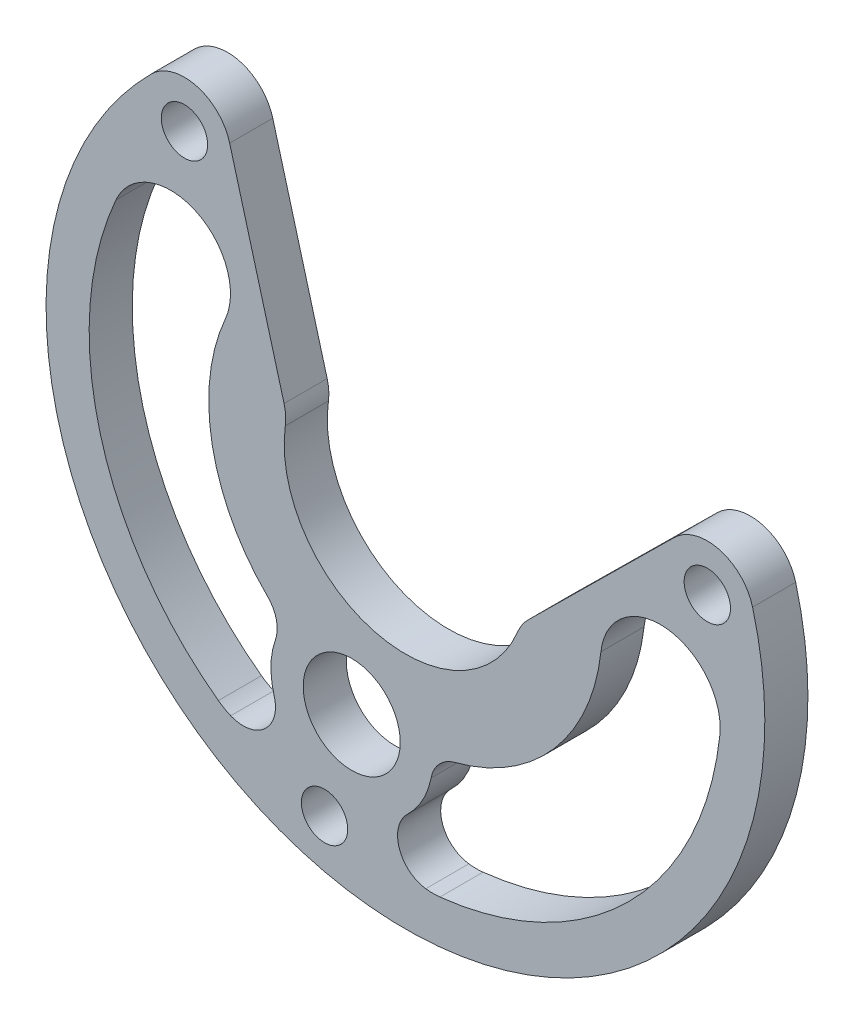
ISO-10303-21;
HEADER;
FILE_DESCRIPTION(('STEP AP214'),'2;1');
FILE_NAME('part.step','',(''),(''),'','','');
FILE_SCHEMA(('AUTOMOTIVE_DESIGN { 1 0 10303 214 1 1 1 1 }'));
ENDSEC;
DATA;
#1=APPLICATION_CONTEXT('core data for automotive mechanical design processes');
#2=APPLICATION_PROTOCOL_DEFINITION('international standard','automotive_design',2000,#1);
#3=PRODUCT_CONTEXT('',#1,'mechanical');
#4=PRODUCT('Part','Part','',(#3));
#5=PRODUCT_RELATED_PRODUCT_CATEGORY('part','',(#4));
#6=PRODUCT_DEFINITION_FORMATION('','',#4);
#7=PRODUCT_DEFINITION_CONTEXT('part definition',#1,'design');
#8=PRODUCT_DEFINITION('design','',#6,#7);
#9=PRODUCT_DEFINITION_SHAPE('','',#8);
#10=(LENGTH_UNIT() NAMED_UNIT(*) SI_UNIT(.MILLI.,.METRE.));
#11=(NAMED_UNIT(*) PLANE_ANGLE_UNIT() SI_UNIT($,.RADIAN.));
#12=(NAMED_UNIT(*) SI_UNIT($,.STERADIAN.) SOLID_ANGLE_UNIT());
#13=UNCERTAINTY_MEASURE_WITH_UNIT(LENGTH_MEASURE(1.E-05),#10,'distance_accuracy_value','');
#14=(GEOMETRIC_REPRESENTATION_CONTEXT(3) GLOBAL_UNCERTAINTY_ASSIGNED_CONTEXT((#13)) GLOBAL_UNIT_ASSIGNED_CONTEXT((#10,
#11,#12)) REPRESENTATION_CONTEXT('',''));
#15=CARTESIAN_POINT('',(0.,0.,0.));
#16=DIRECTION('',(0.,0.,1.));
#17=DIRECTION('',(1.,0.,0.));
#18=AXIS2_PLACEMENT_3D('',#15,#16,#17);
#19=CARTESIAN_POINT('',(130.039734994532,4.8095339761936,4.));
#20=DIRECTION('',(0.,0.,-1.));
#21=DIRECTION('',(-1.,0.,0.));
#22=AXIS2_PLACEMENT_3D('',#19,#20,#21);
#23=CYLINDRICAL_SURFACE('',#22,5.54999999999998);
#24=CARTESIAN_POINT('',(130.039734994532,4.8095339761936,4.));
#25=DIRECTION('',(0.,0.,1.));
#26=DIRECTION('',(1.,0.,0.));
#27=AXIS2_PLACEMENT_3D('',#24,#25,#26);
#28=CIRCLE('',#27,5.54999999999998);
#29=CARTESIAN_POINT('',(126.757039396607,0.334446310978311,4.));
#30=VERTEX_POINT('',#29);
#31=CARTESIAN_POINT('',(127.901748025322,-0.312136817550324,4.));
#32=VERTEX_POINT('',#31);
#33=EDGE_CURVE('E193',#30,#32,#28,.T.);
#34=ORIENTED_EDGE('',*,*,#33,.T.);
#35=DIRECTION('',(0.,0.,-1.));
#36=VECTOR('',#35,1.);
#37=CARTESIAN_POINT('',(127.901748025322,-0.312136817550324,4.));
#38=LINE('',#37,#36);
#39=CARTESIAN_POINT('',(127.901748025322,-0.312136817550324,0.));
#40=VERTEX_POINT('',#39);
#41=EDGE_CURVE('E332',#32,#40,#38,.T.);
#42=ORIENTED_EDGE('',*,*,#41,.T.);
#43=CARTESIAN_POINT('',(130.039734994532,4.8095339761936,0.));
#44=DIRECTION('',(0.,0.,1.));
#45=DIRECTION('',(1.,0.,0.));
#46=AXIS2_PLACEMENT_3D('',#43,#44,#45);
#47=CIRCLE('',#46,5.54999999999998);
#48=CARTESIAN_POINT('',(126.757039396607,0.334446310978304,0.));
#49=VERTEX_POINT('',#48);
#50=EDGE_CURVE('E212',#49,#40,#47,.T.);
#51=ORIENTED_EDGE('',*,*,#50,.F.);
#52=DIRECTION('',(0.,0.,-1.));
#53=VECTOR('',#52,1.);
#54=CARTESIAN_POINT('',(126.757039396607,0.334446310978311,4.));
#55=LINE('',#54,#53);
#56=EDGE_CURVE('E208',#30,#49,#55,.T.);
#57=ORIENTED_EDGE('',*,*,#56,.F.);
#58=EDGE_LOOP('',(#34,#42,#51,#57));
#59=FACE_BOUND('',#58,.T.);
#60=ADVANCED_FACE('F32',(#59),#23,.F.);
#61=CARTESIAN_POINT('',(172.128729043513,31.5057523079725,4.));
#62=DIRECTION('',(0.,0.,1.));
#63=DIRECTION('',(1.,0.,0.));
#64=AXIS2_PLACEMENT_3D('',#61,#62,#63);
#65=PLANE('',#64);
#66=CARTESIAN_POINT('',(139.134613462906,5.40592784393593,4.));
#67=DIRECTION('',(0.,0.,1.));
#68=DIRECTION('',(1.,0.,0.));
#69=AXIS2_PLACEMENT_3D('',#66,#67,#68);
#70=CIRCLE('',#69,4.49999999999999);
#71=CARTESIAN_POINT('',(143.634613462906,5.40592784393593,4.));
#72=VERTEX_POINT('',#71);
#73=EDGE_CURVE('E216',#72,#72,#70,.T.);
#74=ORIENTED_EDGE('',*,*,#73,.F.);
#75=EDGE_LOOP('',(#74));
#76=FACE_BOUND('',#75,.T.);
#77=CARTESIAN_POINT('',(144.11688008113,23.9999999999998,4.));
#78=DIRECTION('',(0.,0.,-1.));
#79=DIRECTION('',(1.,0.,0.));
#80=AXIS2_PLACEMENT_3D('',#77,#78,#79);
#81=CIRCLE('',#80,18.25);
#82=CARTESIAN_POINT('',(131.31932024548,10.9890445295918,4.));
#83=VERTEX_POINT('',#82);
#84=CARTESIAN_POINT('',(127.410923424776,31.3466667405033,4.));
#85=VERTEX_POINT('',#84);
#86=EDGE_CURVE('E181',#83,#85,#81,.T.);
#87=ORIENTED_EDGE('',*,*,#86,.F.);
#88=CARTESIAN_POINT('',(129.215611779345,8.85025732897677,4.));
#89=DIRECTION('',(0.,0.,1.));
#90=DIRECTION('',(1.,0.,0.));
#91=AXIS2_PLACEMENT_3D('',#88,#89,#90);
#92=CIRCLE('',#91,3.);
#93=CARTESIAN_POINT('',(132.049612260363,7.86616319039367,4.));
#94=VERTEX_POINT('',#93);
#95=EDGE_CURVE('E350',#83,#94,#92,.F.);
#96=ORIENTED_EDGE('',*,*,#95,.T.);
#97=CARTESIAN_POINT('',(139.134613462906,5.40592784393593,4.));
#98=DIRECTION('',(0.,0.,1.));
#99=DIRECTION('',(1.,0.,0.));
#100=AXIS2_PLACEMENT_3D('',#97,#98,#99);
#101=CIRCLE('',#100,7.50000000000001);
#102=CARTESIAN_POINT('',(131.936615744636,3.29907501381792,4.));
#103=VERTEX_POINT('',#102);
#104=EDGE_CURVE('E369',#94,#103,#101,.T.);
#105=ORIENTED_EDGE('',*,*,#104,.T.);
#106=CARTESIAN_POINT('',(129.057416657328,2.45633388177073,4.));
#107=DIRECTION('',(0.,0.,1.));
#108=DIRECTION('',(1.,0.,0.));
#109=AXIS2_PLACEMENT_3D('',#106,#107,#108);
#110=CIRCLE('',#109,3.);
#111=EDGE_CURVE('E344',#103,#32,#110,.F.);
#112=ORIENTED_EDGE('',*,*,#111,.T.);
#113=ORIENTED_EDGE('',*,*,#33,.F.);
#114=CARTESIAN_POINT('',(144.11688008113,23.9999999999998,4.));
#115=DIRECTION('',(0.,0.,1.));
#116=DIRECTION('',(1.,0.,0.));
#117=AXIS2_PLACEMENT_3D('',#114,#115,#116);
#118=CIRCLE('',#117,29.35);
#119=CARTESIAN_POINT('',(117.250040198172,35.815050347056,4.));
#120=VERTEX_POINT('',#119);
#121=EDGE_CURVE('E206',#120,#30,#118,.T.);
#122=ORIENTED_EDGE('',*,*,#121,.F.);
#123=CARTESIAN_POINT('',(122.330481811474,33.5808585437796,4.));
#124=DIRECTION('',(0.,0.,1.));
#125=DIRECTION('',(1.,0.,0.));
#126=AXIS2_PLACEMENT_3D('',#123,#124,#125);
#127=CIRCLE('',#126,5.54999999999999);
#128=EDGE_CURVE('E192',#85,#120,#127,.T.);
#129=ORIENTED_EDGE('',*,*,#128,.F.);
#130=EDGE_LOOP('',(#87,#96,#105,#112,#113,#122,#129));
#131=FACE_BOUND('',#130,.T.);
#132=CARTESIAN_POINT('',(146.712812326981,0.341996369622373,4.));
#133=DIRECTION('',(0.,0.,1.));
#134=DIRECTION('',(1.,0.,0.));
#135=AXIS2_PLACEMENT_3D('',#132,#133,#134);
#136=CIRCLE('',#135,5.54999999999999);
#137=CARTESIAN_POINT('',(146.003527958399,-5.1624941321848,4.));
#138=VERTEX_POINT('',#137);
#139=CARTESIAN_POINT('',(147.318166275068,-5.17489103157906,4.));
#140=VERTEX_POINT('',#139);
#141=EDGE_CURVE('E237',#138,#140,#136,.T.);
#142=ORIENTED_EDGE('',*,*,#141,.F.);
#143=CARTESIAN_POINT('',(146.386924914389,-2.18709386093767,4.));
#144=DIRECTION('',(0.,0.,1.));
#145=DIRECTION('',(1.,0.,0.));
#146=AXIS2_PLACEMENT_3D('',#143,#144,#145);
#147=CIRCLE('',#146,3.);
#148=CARTESIAN_POINT('',(144.314835928251,-0.0176590881166413,4.));
#149=VERTEX_POINT('',#148);
#150=EDGE_CURVE('E354',#138,#149,#147,.F.);
#151=ORIENTED_EDGE('',*,*,#150,.T.);
#152=CARTESIAN_POINT('',(146.50052216338,3.99405355198431,4.));
#153=VERTEX_POINT('',#152);
#154=EDGE_CURVE('E359',#149,#153,#101,.T.);
#155=ORIENTED_EDGE('',*,*,#154,.T.);
#156=CARTESIAN_POINT('',(149.44688564357,3.42930383520366,4.));
#157=DIRECTION('',(0.,0.,1.));
#158=DIRECTION('',(1.,0.,0.));
#159=AXIS2_PLACEMENT_3D('',#156,#157,#158);
#160=CIRCLE('',#159,3.);
#161=CARTESIAN_POINT('',(148.694414270049,6.33340211729253,4.));
#162=VERTEX_POINT('',#161);
#163=EDGE_CURVE('E40',#153,#162,#160,.F.);
#164=ORIENTED_EDGE('',*,*,#163,.T.);
#165=CARTESIAN_POINT('',(144.11688008113,23.9999999999998,4.));
#166=DIRECTION('',(0.,0.,-1.));
#167=DIRECTION('',(1.,0.,0.));
#168=AXIS2_PLACEMENT_3D('',#165,#166,#167);
#169=CIRCLE('',#168,18.25);
#170=CARTESIAN_POINT('',(162.257996310306,22.0094217022355,4.));
#171=VERTEX_POINT('',#170);
#172=EDGE_CURVE('E245',#171,#162,#169,.T.);
#173=ORIENTED_EDGE('',*,*,#172,.F.);
#174=CARTESIAN_POINT('',(167.774883711508,21.4040677541483,4.));
#175=DIRECTION('',(0.,0.,1.));
#176=DIRECTION('',(1.,0.,0.));
#177=AXIS2_PLACEMENT_3D('',#174,#175,#176);
#178=CIRCLE('',#177,5.54999999999999);
#179=CARTESIAN_POINT('',(173.291771112709,20.798713806061,4.));
#180=VERTEX_POINT('',#179);
#181=EDGE_CURVE('E242',#180,#171,#178,.T.);
#182=ORIENTED_EDGE('',*,*,#181,.F.);
#183=CARTESIAN_POINT('',(144.11688008113,23.9999999999998,4.));
#184=DIRECTION('',(0.,0.,1.));
#185=DIRECTION('',(1.,0.,0.));
#186=AXIS2_PLACEMENT_3D('',#183,#184,#185);
#187=CIRCLE('',#186,29.35);
#188=EDGE_CURVE('E239',#140,#180,#187,.T.);
#189=ORIENTED_EDGE('',*,*,#188,.F.);
#190=EDGE_LOOP('',(#142,#151,#155,#164,#173,#182,#189));
#191=FACE_BOUND('',#190,.T.);
#192=CARTESIAN_POINT('',(172.128729043513,31.5057523079725,4.));
#193=DIRECTION('',(0.,0.,1.));
#194=DIRECTION('',(1.,0.,0.));
#195=AXIS2_PLACEMENT_3D('',#192,#193,#194);
#196=CIRCLE('',#195,2.15000000000002);
#197=CARTESIAN_POINT('',(174.278729043513,31.5057523079725,4.));
#198=VERTEX_POINT('',#197);
#199=EDGE_CURVE('E231',#198,#198,#196,.T.);
#200=ORIENTED_EDGE('',*,*,#199,.F.);
#201=EDGE_LOOP('',(#200));
#202=FACE_BOUND('',#201,.T.);
#203=CARTESIAN_POINT('',(172.128729043513,31.5057523079725,4.));
#204=DIRECTION('',(0.,0.,1.));
#205=DIRECTION('',(1.,0.,0.));
#206=AXIS2_PLACEMENT_3D('',#203,#204,#205);
#207=CIRCLE('',#206,4.34999999999998);
#208=CARTESIAN_POINT('',(176.330506387871,32.6316151541685,4.));
#209=VERTEX_POINT('',#208);
#210=CARTESIAN_POINT('',(169.071208826311,34.5999517393923,4.));
#211=VERTEX_POINT('',#210);
#212=EDGE_CURVE('E269',#209,#211,#207,.T.);
#213=ORIENTED_EDGE('',*,*,#212,.T.);
#214=DIRECTION('',(-0.711310214119489,-0.702878210851131,0.));
#215=VECTOR('',#214,1.);
#216=CARTESIAN_POINT('',(169.071208826311,34.5999517393923,4.));
#217=LINE('',#216,#215);
#218=CARTESIAN_POINT('',(155.497898469746,21.1875419224473,4.));
#219=VERTEX_POINT('',#218);
#220=EDGE_CURVE('E272',#211,#219,#217,.T.);
#221=ORIENTED_EDGE('',*,*,#220,.T.);
#222=CARTESIAN_POINT('',(158.555418686949,18.0933424910275,4.));
#223=DIRECTION('',(0.,0.,1.));
#224=DIRECTION('',(1.,0.,0.));
#225=AXIS2_PLACEMENT_3D('',#222,#223,#224);
#226=CIRCLE('',#225,4.34999999999999);
#227=CARTESIAN_POINT('',(154.529287729557,19.740391219491,4.));
#228=VERTEX_POINT('',#227);
#229=EDGE_CURVE('E275',#219,#228,#226,.T.);
#230=ORIENTED_EDGE('',*,*,#229,.T.);
#231=CARTESIAN_POINT('',(144.11688008113,23.9999999999998,4.));
#232=DIRECTION('',(0.,0.,-1.));
#233=DIRECTION('',(1.,0.,0.));
#234=AXIS2_PLACEMENT_3D('',#231,#232,#233);
#235=CIRCLE('',#234,11.25);
#236=CARTESIAN_POINT('',(132.969666152779,25.5172744101105,4.));
#237=VERTEX_POINT('',#236);
#238=EDGE_CURVE('E277',#228,#237,#235,.T.);
#239=ORIENTED_EDGE('',*,*,#238,.T.);
#240=CARTESIAN_POINT('',(128.659410100484,26.1039538486866,4.));
#241=DIRECTION('',(0.,0.,1.));
#242=DIRECTION('',(1.,0.,0.));
#243=AXIS2_PLACEMENT_3D('',#240,#241,#242);
#244=CIRCLE('',#243,4.35000000000001);
#245=CARTESIAN_POINT('',(132.854399996875,27.2548490520706,4.));
#246=VERTEX_POINT('',#245);
#247=EDGE_CURVE('E279',#237,#246,#244,.T.);
#248=ORIENTED_EDGE('',*,*,#247,.T.);
#249=DIRECTION('',(-0.264573609973319,0.964365493423363,0.));
#250=VECTOR('',#249,1.);
#251=CARTESIAN_POINT('',(132.854399996875,27.2548490520706,4.));
#252=LINE('',#251,#250);
#253=CARTESIAN_POINT('',(127.805773323111,45.6569918577949,4.));
#254=VERTEX_POINT('',#253);
#255=EDGE_CURVE('E281',#246,#254,#252,.T.);
#256=ORIENTED_EDGE('',*,*,#255,.T.);
#257=CARTESIAN_POINT('',(123.61078342672,44.5060966544112,4.));
#258=DIRECTION('',(0.,0.,1.));
#259=DIRECTION('',(-1.,0.,0.));
#260=AXIS2_PLACEMENT_3D('',#257,#258,#259);
#261=CIRCLE('',#260,4.34999999999889);
#262=CARTESIAN_POINT('',(120.53486892856,47.582011152572,4.));
#263=VERTEX_POINT('',#262);
#264=EDGE_CURVE('E283',#254,#263,#261,.T.);
#265=ORIENTED_EDGE('',*,*,#264,.T.);
#266=CARTESIAN_POINT('',(144.11688008113,23.9999999999998,4.));
#267=DIRECTION('',(0.,0.,1.));
#268=DIRECTION('',(1.,0.,0.));
#269=AXIS2_PLACEMENT_3D('',#266,#267,#268);
#270=CIRCLE('',#269,33.35);
#271=EDGE_CURVE('E285',#263,#209,#270,.T.);
#272=ORIENTED_EDGE('',*,*,#271,.T.);
#273=EDGE_LOOP('',(#213,#221,#230,#239,#248,#256,#265,#272));
#274=FACE_BOUND('',#273,.T.);
#275=CARTESIAN_POINT('',(123.61078342672,44.5060966544112,4.));
#276=DIRECTION('',(0.,0.,1.));
#277=DIRECTION('',(1.,0.,0.));
#278=AXIS2_PLACEMENT_3D('',#275,#276,#277);
#279=CIRCLE('',#278,2.15);
#280=CARTESIAN_POINT('',(125.76078342672,44.5060966544112,4.));
#281=VERTEX_POINT('',#280);
#282=EDGE_CURVE('E263',#281,#281,#279,.T.);
#283=ORIENTED_EDGE('',*,*,#282,.F.);
#284=EDGE_LOOP('',(#283));
#285=FACE_BOUND('',#284,.T.);
#286=CARTESIAN_POINT('',(136.611127773157,-4.01184896238429,4.));
#287=DIRECTION('',(0.,0.,1.));
#288=DIRECTION('',(1.,0.,0.));
#289=AXIS2_PLACEMENT_3D('',#286,#287,#288);
#290=CIRCLE('',#289,2.15000000000002);
#291=CARTESIAN_POINT('',(138.761127773157,-4.01184896238429,4.));
#292=VERTEX_POINT('',#291);
#293=EDGE_CURVE('E225',#292,#292,#290,.T.);
#294=ORIENTED_EDGE('',*,*,#293,.F.);
#295=EDGE_LOOP('',(#294));
#296=FACE_BOUND('',#295,.T.);
#297=ADVANCED_FACE('F204',(#76,#131,#191,#202,#274,#285,#296),#65,.T.);
#298=CARTESIAN_POINT('',(172.128729043513,31.5057523079725,0.));
#299=DIRECTION('',(0.,0.,1.));
#300=DIRECTION('',(1.,0.,0.));
#301=AXIS2_PLACEMENT_3D('',#298,#299,#300);
#302=PLANE('',#301);
#303=CARTESIAN_POINT('',(139.134613462906,5.40592784393593,0.));
#304=DIRECTION('',(0.,0.,-1.));
#305=DIRECTION('',(-1.,0.,0.));
#306=AXIS2_PLACEMENT_3D('',#303,#304,#305);
#307=CIRCLE('',#306,4.49999999999999);
#308=CARTESIAN_POINT('',(134.634613462906,5.40592784393593,0.));
#309=VERTEX_POINT('',#308);
#310=EDGE_CURVE('E482',#309,#309,#307,.T.);
#311=ORIENTED_EDGE('',*,*,#310,.F.);
#312=EDGE_LOOP('',(#311));
#313=FACE_BOUND('',#312,.T.);
#314=CARTESIAN_POINT('',(139.134613462906,5.40592784393593,0.));
#315=DIRECTION('',(0.,0.,1.));
#316=DIRECTION('',(1.,0.,0.));
#317=AXIS2_PLACEMENT_3D('',#314,#315,#316);
#318=CIRCLE('',#317,7.50000000000001);
#319=CARTESIAN_POINT('',(132.049612260363,7.86616319039367,0.));
#320=VERTEX_POINT('',#319);
#321=CARTESIAN_POINT('',(131.936615744636,3.29907501381792,0.));
#322=VERTEX_POINT('',#321);
#323=EDGE_CURVE('E479',#320,#322,#318,.T.);
#324=ORIENTED_EDGE('',*,*,#323,.F.);
#325=CARTESIAN_POINT('',(129.215611779345,8.85025732897677,0.));
#326=DIRECTION('',(0.,0.,1.));
#327=DIRECTION('',(1.,0.,0.));
#328=AXIS2_PLACEMENT_3D('',#325,#326,#327);
#329=CIRCLE('',#328,3.);
#330=CARTESIAN_POINT('',(131.31932024548,10.9890445295918,0.));
#331=VERTEX_POINT('',#330);
#332=EDGE_CURVE('E348',#320,#331,#329,.T.);
#333=ORIENTED_EDGE('',*,*,#332,.T.);
#334=CARTESIAN_POINT('',(144.11688008113,23.9999999999998,0.));
#335=DIRECTION('',(0.,0.,-1.));
#336=DIRECTION('',(1.,0.,0.));
#337=AXIS2_PLACEMENT_3D('',#334,#335,#336);
#338=CIRCLE('',#337,18.25);
#339=CARTESIAN_POINT('',(127.410923424776,31.3466667405033,0.));
#340=VERTEX_POINT('',#339);
#341=EDGE_CURVE('E215',#331,#340,#338,.T.);
#342=ORIENTED_EDGE('',*,*,#341,.T.);
#343=CARTESIAN_POINT('',(122.330481811474,33.5808585437796,0.));
#344=DIRECTION('',(0.,0.,1.));
#345=DIRECTION('',(1.,0.,0.));
#346=AXIS2_PLACEMENT_3D('',#343,#344,#345);
#347=CIRCLE('',#346,5.54999999999999);
#348=CARTESIAN_POINT('',(117.250040198172,35.815050347056,0.));
#349=VERTEX_POINT('',#348);
#350=EDGE_CURVE('E200',#340,#349,#347,.T.);
#351=ORIENTED_EDGE('',*,*,#350,.T.);
#352=CARTESIAN_POINT('',(144.11688008113,23.9999999999998,0.));
#353=DIRECTION('',(0.,0.,1.));
#354=DIRECTION('',(1.,0.,0.));
#355=AXIS2_PLACEMENT_3D('',#352,#353,#354);
#356=CIRCLE('',#355,29.35);
#357=EDGE_CURVE('E219',#349,#49,#356,.T.);
#358=ORIENTED_EDGE('',*,*,#357,.T.);
#359=ORIENTED_EDGE('',*,*,#50,.T.);
#360=CARTESIAN_POINT('',(129.057416657328,2.45633388177073,0.));
#361=DIRECTION('',(0.,0.,1.));
#362=DIRECTION('',(1.,0.,0.));
#363=AXIS2_PLACEMENT_3D('',#360,#361,#362);
#364=CIRCLE('',#363,3.);
#365=EDGE_CURVE('E346',#40,#322,#364,.T.);
#366=ORIENTED_EDGE('',*,*,#365,.T.);
#367=EDGE_LOOP('',(#324,#333,#342,#351,#358,#359,#366));
#368=FACE_BOUND('',#367,.T.);
#369=CARTESIAN_POINT('',(136.611127773157,-4.01184896238429,0.));
#370=DIRECTION('',(0.,0.,1.));
#371=DIRECTION('',(1.,0.,0.));
#372=AXIS2_PLACEMENT_3D('',#369,#370,#371);
#373=CIRCLE('',#372,2.15000000000002);
#374=CARTESIAN_POINT('',(138.761127773157,-4.01184896238429,0.));
#375=VERTEX_POINT('',#374);
#376=EDGE_CURVE('E201',#375,#375,#373,.T.);
#377=ORIENTED_EDGE('',*,*,#376,.T.);
#378=EDGE_LOOP('',(#377));
#379=FACE_BOUND('',#378,.T.);
#380=CARTESIAN_POINT('',(172.128729043513,31.5057523079725,0.));
#381=DIRECTION('',(0.,0.,1.));
#382=DIRECTION('',(1.,0.,0.));
#383=AXIS2_PLACEMENT_3D('',#380,#381,#382);
#384=CIRCLE('',#383,2.15000000000002);
#385=CARTESIAN_POINT('',(174.278729043513,31.5057523079725,0.));
#386=VERTEX_POINT('',#385);
#387=EDGE_CURVE('E228',#386,#386,#384,.T.);
#388=ORIENTED_EDGE('',*,*,#387,.T.);
#389=EDGE_LOOP('',(#388));
#390=FACE_BOUND('',#389,.T.);
#391=CARTESIAN_POINT('',(144.11688008113,23.9999999999998,0.));
#392=DIRECTION('',(0.,0.,-1.));
#393=DIRECTION('',(1.,0.,0.));
#394=AXIS2_PLACEMENT_3D('',#391,#392,#393);
#395=CIRCLE('',#394,18.25);
#396=CARTESIAN_POINT('',(162.257996310306,22.0094217022355,0.));
#397=VERTEX_POINT('',#396);
#398=CARTESIAN_POINT('',(148.694414270049,6.33340211729253,0.));
#399=VERTEX_POINT('',#398);
#400=EDGE_CURVE('E240',#397,#399,#395,.T.);
#401=ORIENTED_EDGE('',*,*,#400,.T.);
#402=CARTESIAN_POINT('',(149.44688564357,3.42930383520366,0.));
#403=DIRECTION('',(0.,0.,1.));
#404=DIRECTION('',(1.,0.,0.));
#405=AXIS2_PLACEMENT_3D('',#402,#403,#404);
#406=CIRCLE('',#405,3.);
#407=CARTESIAN_POINT('',(146.50052216338,3.99405355198431,0.));
#408=VERTEX_POINT('',#407);
#409=EDGE_CURVE('E11',#399,#408,#406,.T.);
#410=ORIENTED_EDGE('',*,*,#409,.T.);
#411=CARTESIAN_POINT('',(144.314835928251,-0.0176590881166413,0.));
#412=VERTEX_POINT('',#411);
#413=EDGE_CURVE('E377',#412,#408,#318,.T.);
#414=ORIENTED_EDGE('',*,*,#413,.F.);
#415=CARTESIAN_POINT('',(146.386924914389,-2.18709386093767,0.));
#416=DIRECTION('',(0.,0.,1.));
#417=DIRECTION('',(1.,0.,0.));
#418=AXIS2_PLACEMENT_3D('',#415,#416,#417);
#419=CIRCLE('',#418,3.);
#420=CARTESIAN_POINT('',(146.003527958399,-5.1624941321848,0.));
#421=VERTEX_POINT('',#420);
#422=EDGE_CURVE('E352',#412,#421,#419,.T.);
#423=ORIENTED_EDGE('',*,*,#422,.T.);
#424=CARTESIAN_POINT('',(146.712812326981,0.341996369622373,0.));
#425=DIRECTION('',(0.,0.,1.));
#426=DIRECTION('',(1.,0.,0.));
#427=AXIS2_PLACEMENT_3D('',#424,#425,#426);
#428=CIRCLE('',#427,5.54999999999999);
#429=CARTESIAN_POINT('',(147.318166275068,-5.17489103157906,0.));
#430=VERTEX_POINT('',#429);
#431=EDGE_CURVE('E234',#421,#430,#428,.T.);
#432=ORIENTED_EDGE('',*,*,#431,.T.);
#433=CARTESIAN_POINT('',(144.11688008113,23.9999999999998,0.));
#434=DIRECTION('',(0.,0.,1.));
#435=DIRECTION('',(1.,0.,0.));
#436=AXIS2_PLACEMENT_3D('',#433,#434,#435);
#437=CIRCLE('',#436,29.35);
#438=CARTESIAN_POINT('',(173.291771112709,20.798713806061,0.));
#439=VERTEX_POINT('',#438);
#440=EDGE_CURVE('E249',#430,#439,#437,.T.);
#441=ORIENTED_EDGE('',*,*,#440,.T.);
#442=CARTESIAN_POINT('',(167.774883711508,21.4040677541483,0.));
#443=DIRECTION('',(0.,0.,1.));
#444=DIRECTION('',(1.,0.,0.));
#445=AXIS2_PLACEMENT_3D('',#442,#443,#444);
#446=CIRCLE('',#445,5.54999999999999);
#447=EDGE_CURVE('E252',#439,#397,#446,.T.);
#448=ORIENTED_EDGE('',*,*,#447,.T.);
#449=EDGE_LOOP('',(#401,#410,#414,#423,#432,#441,#448));
#450=FACE_BOUND('',#449,.T.);
#451=CARTESIAN_POINT('',(172.128729043513,31.5057523079725,0.));
#452=DIRECTION('',(0.,0.,1.));
#453=DIRECTION('',(1.,0.,0.));
#454=AXIS2_PLACEMENT_3D('',#451,#452,#453);
#455=CIRCLE('',#454,4.34999999999998);
#456=CARTESIAN_POINT('',(176.330506387871,32.6316151541685,0.));
#457=VERTEX_POINT('',#456);
#458=CARTESIAN_POINT('',(169.071208826311,34.5999517393923,0.));
#459=VERTEX_POINT('',#458);
#460=EDGE_CURVE('E266',#457,#459,#455,.T.);
#461=ORIENTED_EDGE('',*,*,#460,.F.);
#462=CARTESIAN_POINT('',(144.11688008113,23.9999999999998,0.));
#463=DIRECTION('',(0.,0.,1.));
#464=DIRECTION('',(1.,0.,0.));
#465=AXIS2_PLACEMENT_3D('',#462,#463,#464);
#466=CIRCLE('',#465,33.35);
#467=CARTESIAN_POINT('',(120.53486892856,47.582011152572,0.));
#468=VERTEX_POINT('',#467);
#469=EDGE_CURVE('E273',#468,#457,#466,.T.);
#470=ORIENTED_EDGE('',*,*,#469,.F.);
#471=CARTESIAN_POINT('',(123.61078342672,44.5060966544112,0.));
#472=DIRECTION('',(0.,0.,1.));
#473=DIRECTION('',(-1.,0.,0.));
#474=AXIS2_PLACEMENT_3D('',#471,#472,#473);
#475=CIRCLE('',#474,4.34999999999889);
#476=CARTESIAN_POINT('',(127.805773323111,45.6569918577949,0.));
#477=VERTEX_POINT('',#476);
#478=EDGE_CURVE('E300',#477,#468,#475,.T.);
#479=ORIENTED_EDGE('',*,*,#478,.F.);
#480=DIRECTION('',(-0.264573609973319,0.964365493423363,0.));
#481=VECTOR('',#480,1.);
#482=CARTESIAN_POINT('',(132.854399996875,27.2548490520706,0.));
#483=LINE('',#482,#481);
#484=CARTESIAN_POINT('',(132.854399996875,27.2548490520706,0.));
#485=VERTEX_POINT('',#484);
#486=EDGE_CURVE('E298',#485,#477,#483,.T.);
#487=ORIENTED_EDGE('',*,*,#486,.F.);
#488=CARTESIAN_POINT('',(128.659410100484,26.1039538486866,0.));
#489=DIRECTION('',(0.,0.,1.));
#490=DIRECTION('',(1.,0.,0.));
#491=AXIS2_PLACEMENT_3D('',#488,#489,#490);
#492=CIRCLE('',#491,4.35000000000001);
#493=CARTESIAN_POINT('',(132.969666152779,25.5172744101105,0.));
#494=VERTEX_POINT('',#493);
#495=EDGE_CURVE('E296',#494,#485,#492,.T.);
#496=ORIENTED_EDGE('',*,*,#495,.F.);
#497=CARTESIAN_POINT('',(144.11688008113,23.9999999999998,0.));
#498=DIRECTION('',(0.,0.,-1.));
#499=DIRECTION('',(1.,0.,0.));
#500=AXIS2_PLACEMENT_3D('',#497,#498,#499);
#501=CIRCLE('',#500,11.25);
#502=CARTESIAN_POINT('',(154.529287729557,19.740391219491,0.));
#503=VERTEX_POINT('',#502);
#504=EDGE_CURVE('E294',#503,#494,#501,.T.);
#505=ORIENTED_EDGE('',*,*,#504,.F.);
#506=CARTESIAN_POINT('',(158.555418686949,18.0933424910275,0.));
#507=DIRECTION('',(0.,0.,1.));
#508=DIRECTION('',(1.,0.,0.));
#509=AXIS2_PLACEMENT_3D('',#506,#507,#508);
#510=CIRCLE('',#509,4.34999999999999);
#511=CARTESIAN_POINT('',(155.497898469746,21.1875419224473,0.));
#512=VERTEX_POINT('',#511);
#513=EDGE_CURVE('E292',#512,#503,#510,.T.);
#514=ORIENTED_EDGE('',*,*,#513,.F.);
#515=DIRECTION('',(-0.711310214119489,-0.702878210851131,0.));
#516=VECTOR('',#515,1.);
#517=CARTESIAN_POINT('',(169.071208826311,34.5999517393923,0.));
#518=LINE('',#517,#516);
#519=EDGE_CURVE('E290',#459,#512,#518,.T.);
#520=ORIENTED_EDGE('',*,*,#519,.F.);
#521=EDGE_LOOP('',(#461,#470,#479,#487,#496,#505,#514,#520));
#522=FACE_BOUND('',#521,.T.);
#523=CARTESIAN_POINT('',(123.61078342672,44.5060966544112,0.));
#524=DIRECTION('',(0.,0.,1.));
#525=DIRECTION('',(1.,0.,0.));
#526=AXIS2_PLACEMENT_3D('',#523,#524,#525);
#527=CIRCLE('',#526,2.15);
#528=CARTESIAN_POINT('',(125.76078342672,44.5060966544112,0.));
#529=VERTEX_POINT('',#528);
#530=EDGE_CURVE('E262',#529,#529,#527,.T.);
#531=ORIENTED_EDGE('',*,*,#530,.T.);
#532=EDGE_LOOP('',(#531));
#533=FACE_BOUND('',#532,.T.);
#534=ADVANCED_FACE('F374',(#313,#368,#379,#390,#450,#522,#533),#302,.F.);
#535=CARTESIAN_POINT('',(172.128729043513,31.5057523079725,4.));
#536=DIRECTION('',(0.,0.,-1.));
#537=DIRECTION('',(-1.,0.,0.));
#538=AXIS2_PLACEMENT_3D('',#535,#536,#537);
#539=CYLINDRICAL_SURFACE('',#538,4.34999999999998);
#540=ORIENTED_EDGE('',*,*,#460,.T.);
#541=DIRECTION('',(0.,0.,-1.));
#542=VECTOR('',#541,1.);
#543=CARTESIAN_POINT('',(169.071208826311,34.5999517393923,4.));
#544=LINE('',#543,#542);
#545=EDGE_CURVE('E323',#211,#459,#544,.T.);
#546=ORIENTED_EDGE('',*,*,#545,.F.);
#547=ORIENTED_EDGE('',*,*,#212,.F.);
#548=DIRECTION('',(0.,0.,-1.));
#549=VECTOR('',#548,1.);
#550=CARTESIAN_POINT('',(176.330506387871,32.6316151541685,4.));
#551=LINE('',#550,#549);
#552=EDGE_CURVE('E287',#209,#457,#551,.T.);
#553=ORIENTED_EDGE('',*,*,#552,.T.);
#554=EDGE_LOOP('',(#540,#546,#547,#553));
#555=FACE_BOUND('',#554,.T.);
#556=ADVANCED_FACE('F431',(#555),#539,.T.);
#557=CARTESIAN_POINT('',(169.071208826311,34.5999517393923,4.));
#558=DIRECTION('',(0.702878210851131,-0.711310214119489,0.));
#559=DIRECTION('',(0.711310214119489,0.702878210851131,0.));
#560=AXIS2_PLACEMENT_3D('',#557,#558,#559);
#561=PLANE('',#560);
#562=ORIENTED_EDGE('',*,*,#519,.T.);
#563=DIRECTION('',(0.,0.,-1.));
#564=VECTOR('',#563,1.);
#565=CARTESIAN_POINT('',(155.497898469746,21.1875419224473,4.));
#566=LINE('',#565,#564);
#567=EDGE_CURVE('E320',#219,#512,#566,.T.);
#568=ORIENTED_EDGE('',*,*,#567,.F.);
#569=ORIENTED_EDGE('',*,*,#220,.F.);
#570=ORIENTED_EDGE('',*,*,#545,.T.);
#571=EDGE_LOOP('',(#562,#568,#569,#570));
#572=FACE_BOUND('',#571,.T.);
#573=ADVANCED_FACE('F455',(#572),#561,.F.);
#574=CARTESIAN_POINT('',(158.555418686949,18.0933424910275,4.));
#575=DIRECTION('',(0.,0.,-1.));
#576=DIRECTION('',(-1.,0.,0.));
#577=AXIS2_PLACEMENT_3D('',#574,#575,#576);
#578=CYLINDRICAL_SURFACE('',#577,4.34999999999999);
#579=ORIENTED_EDGE('',*,*,#513,.T.);
#580=DIRECTION('',(0.,0.,-1.));
#581=VECTOR('',#580,1.);
#582=CARTESIAN_POINT('',(154.529287729557,19.740391219491,4.));
#583=LINE('',#582,#581);
#584=EDGE_CURVE('E317',#228,#503,#583,.T.);
#585=ORIENTED_EDGE('',*,*,#584,.F.);
#586=ORIENTED_EDGE('',*,*,#229,.F.);
#587=ORIENTED_EDGE('',*,*,#567,.T.);
#588=EDGE_LOOP('',(#579,#585,#586,#587));
#589=FACE_BOUND('',#588,.T.);
#590=ADVANCED_FACE('F451',(#589),#578,.T.);
#591=CARTESIAN_POINT('',(144.11688008113,23.9999999999998,4.));
#592=DIRECTION('',(0.,0.,-1.));
#593=DIRECTION('',(-1.,0.,0.));
#594=AXIS2_PLACEMENT_3D('',#591,#592,#593);
#595=CYLINDRICAL_SURFACE('',#594,11.25);
#596=ORIENTED_EDGE('',*,*,#504,.T.);
#597=DIRECTION('',(0.,0.,-1.));
#598=VECTOR('',#597,1.);
#599=CARTESIAN_POINT('',(132.969666152779,25.5172744101105,4.));
#600=LINE('',#599,#598);
#601=EDGE_CURVE('E314',#237,#494,#600,.T.);
#602=ORIENTED_EDGE('',*,*,#601,.F.);
#603=ORIENTED_EDGE('',*,*,#238,.F.);
#604=ORIENTED_EDGE('',*,*,#584,.T.);
#605=EDGE_LOOP('',(#596,#602,#603,#604));
#606=FACE_BOUND('',#605,.T.);
#607=ADVANCED_FACE('F447',(#606),#595,.F.);
#608=CARTESIAN_POINT('',(128.659410100484,26.1039538486866,4.));
#609=DIRECTION('',(0.,0.,-1.));
#610=DIRECTION('',(-1.,0.,0.));
#611=AXIS2_PLACEMENT_3D('',#608,#609,#610);
#612=CYLINDRICAL_SURFACE('',#611,4.35000000000001);
#613=ORIENTED_EDGE('',*,*,#495,.T.);
#614=DIRECTION('',(0.,0.,-1.));
#615=VECTOR('',#614,1.);
#616=CARTESIAN_POINT('',(132.854399996875,27.2548490520706,4.));
#617=LINE('',#616,#615);
#618=EDGE_CURVE('E311',#246,#485,#617,.T.);
#619=ORIENTED_EDGE('',*,*,#618,.F.);
#620=ORIENTED_EDGE('',*,*,#247,.F.);
#621=ORIENTED_EDGE('',*,*,#601,.T.);
#622=EDGE_LOOP('',(#613,#619,#620,#621));
#623=FACE_BOUND('',#622,.T.);
#624=ADVANCED_FACE('F443',(#623),#612,.T.);
#625=CARTESIAN_POINT('',(132.854399996875,27.2548490520706,4.));
#626=DIRECTION('',(-0.964365493423363,-0.26457360997332,0.));
#627=DIRECTION('',(0.264573609973319,-0.964365493423363,0.));
#628=AXIS2_PLACEMENT_3D('',#625,#626,#627);
#629=PLANE('',#628);
#630=ORIENTED_EDGE('',*,*,#486,.T.);
#631=DIRECTION('',(0.,0.,-1.));
#632=VECTOR('',#631,1.);
#633=CARTESIAN_POINT('',(127.805773323111,45.6569918577949,4.));
#634=LINE('',#633,#632);
#635=EDGE_CURVE('E308',#254,#477,#634,.T.);
#636=ORIENTED_EDGE('',*,*,#635,.F.);
#637=ORIENTED_EDGE('',*,*,#255,.F.);
#638=ORIENTED_EDGE('',*,*,#618,.T.);
#639=EDGE_LOOP('',(#630,#636,#637,#638));
#640=FACE_BOUND('',#639,.T.);
#641=ADVANCED_FACE('F439',(#640),#629,.F.);
#642=CARTESIAN_POINT('',(123.61078342672,44.5060966544112,4.));
#643=DIRECTION('',(0.,0.,-1.));
#644=DIRECTION('',(-1.,0.,0.));
#645=AXIS2_PLACEMENT_3D('',#642,#643,#644);
#646=CYLINDRICAL_SURFACE('',#645,4.34999999999889);
#647=ORIENTED_EDGE('',*,*,#478,.T.);
#648=DIRECTION('',(0.,0.,-1.));
#649=VECTOR('',#648,1.);
#650=CARTESIAN_POINT('',(120.53486892856,47.582011152572,4.));
#651=LINE('',#650,#649);
#652=EDGE_CURVE('E305',#263,#468,#651,.T.);
#653=ORIENTED_EDGE('',*,*,#652,.F.);
#654=ORIENTED_EDGE('',*,*,#264,.F.);
#655=ORIENTED_EDGE('',*,*,#635,.T.);
#656=EDGE_LOOP('',(#647,#653,#654,#655));
#657=FACE_BOUND('',#656,.T.);
#658=ADVANCED_FACE('F435',(#657),#646,.T.);
#659=CARTESIAN_POINT('',(144.11688008113,23.9999999999998,4.));
#660=DIRECTION('',(0.,0.,-1.));
#661=DIRECTION('',(-1.,0.,0.));
#662=AXIS2_PLACEMENT_3D('',#659,#660,#661);
#663=CYLINDRICAL_SURFACE('',#662,33.35);
#664=ORIENTED_EDGE('',*,*,#469,.T.);
#665=ORIENTED_EDGE('',*,*,#552,.F.);
#666=ORIENTED_EDGE('',*,*,#271,.F.);
#667=ORIENTED_EDGE('',*,*,#652,.T.);
#668=EDGE_LOOP('',(#664,#665,#666,#667));
#669=FACE_BOUND('',#668,.T.);
#670=ADVANCED_FACE('F426',(#669),#663,.T.);
#671=CARTESIAN_POINT('',(123.61078342672,44.5060966544112,4.));
#672=DIRECTION('',(0.,0.,-1.));
#673=DIRECTION('',(-1.,0.,0.));
#674=AXIS2_PLACEMENT_3D('',#671,#672,#673);
#675=CYLINDRICAL_SURFACE('',#674,2.15);
#676=ORIENTED_EDGE('',*,*,#282,.T.);
#677=EDGE_LOOP('',(#676));
#678=FACE_BOUND('',#677,.T.);
#679=ORIENTED_EDGE('',*,*,#530,.F.);
#680=EDGE_LOOP('',(#679));
#681=FACE_BOUND('',#680,.T.);
#682=ADVANCED_FACE('F424',(#678,#681),#675,.F.);
#683=CARTESIAN_POINT('',(146.712812326981,0.341996369622373,4.));
#684=DIRECTION('',(0.,0.,-1.));
#685=DIRECTION('',(-1.,0.,0.));
#686=AXIS2_PLACEMENT_3D('',#683,#684,#685);
#687=CYLINDRICAL_SURFACE('',#686,5.54999999999999);
#688=ORIENTED_EDGE('',*,*,#431,.F.);
#689=DIRECTION('',(0.,0.,-1.));
#690=VECTOR('',#689,1.);
#691=CARTESIAN_POINT('',(146.003527958399,-5.1624941321848,4.));
#692=LINE('',#691,#690);
#693=EDGE_CURVE('E341',#421,#138,#692,.F.);
#694=ORIENTED_EDGE('',*,*,#693,.T.);
#695=ORIENTED_EDGE('',*,*,#141,.T.);
#696=DIRECTION('',(0.,0.,-1.));
#697=VECTOR('',#696,1.);
#698=CARTESIAN_POINT('',(147.318166275068,-5.17489103157906,4.));
#699=LINE('',#698,#697);
#700=EDGE_CURVE('E259',#140,#430,#699,.T.);
#701=ORIENTED_EDGE('',*,*,#700,.T.);
#702=EDGE_LOOP('',(#688,#694,#695,#701));
#703=FACE_BOUND('',#702,.T.);
#704=ADVANCED_FACE('F379',(#703),#687,.F.);
#705=CARTESIAN_POINT('',(144.11688008113,23.9999999999998,4.));
#706=DIRECTION('',(0.,0.,-1.));
#707=DIRECTION('',(-1.,0.,0.));
#708=AXIS2_PLACEMENT_3D('',#705,#706,#707);
#709=CYLINDRICAL_SURFACE('',#708,29.35);
#710=ORIENTED_EDGE('',*,*,#440,.F.);
#711=ORIENTED_EDGE('',*,*,#700,.F.);
#712=ORIENTED_EDGE('',*,*,#188,.T.);
#713=DIRECTION('',(0.,0.,-1.));
#714=VECTOR('',#713,1.);
#715=CARTESIAN_POINT('',(173.291771112709,20.798713806061,4.));
#716=LINE('',#715,#714);
#717=EDGE_CURVE('E257',#180,#439,#716,.T.);
#718=ORIENTED_EDGE('',*,*,#717,.T.);
#719=EDGE_LOOP('',(#710,#711,#712,#718));
#720=FACE_BOUND('',#719,.T.);
#721=ADVANCED_FACE('F382',(#720),#709,.F.);
#722=CARTESIAN_POINT('',(167.774883711508,21.4040677541483,4.));
#723=DIRECTION('',(0.,0.,-1.));
#724=DIRECTION('',(-1.,0.,0.));
#725=AXIS2_PLACEMENT_3D('',#722,#723,#724);
#726=CYLINDRICAL_SURFACE('',#725,5.54999999999999);
#727=ORIENTED_EDGE('',*,*,#447,.F.);
#728=ORIENTED_EDGE('',*,*,#717,.F.);
#729=ORIENTED_EDGE('',*,*,#181,.T.);
#730=DIRECTION('',(0.,0.,-1.));
#731=VECTOR('',#730,1.);
#732=CARTESIAN_POINT('',(162.257996310306,22.0094217022355,4.));
#733=LINE('',#732,#731);
#734=EDGE_CURVE('E247',#171,#397,#733,.T.);
#735=ORIENTED_EDGE('',*,*,#734,.T.);
#736=EDGE_LOOP('',(#727,#728,#729,#735));
#737=FACE_BOUND('',#736,.T.);
#738=ADVANCED_FACE('F387',(#737),#726,.F.);
#739=CARTESIAN_POINT('',(144.11688008113,23.9999999999998,4.));
#740=DIRECTION('',(0.,0.,-1.));
#741=DIRECTION('',(-1.,0.,0.));
#742=AXIS2_PLACEMENT_3D('',#739,#740,#741);
#743=CYLINDRICAL_SURFACE('',#742,18.25);
#744=ORIENTED_EDGE('',*,*,#172,.T.);
#745=DIRECTION('',(0.,0.,-1.));
#746=VECTOR('',#745,1.);
#747=CARTESIAN_POINT('',(148.694414270049,6.33340211729252,4.));
#748=LINE('',#747,#746);
#749=EDGE_CURVE('E53',#162,#399,#748,.T.);
#750=ORIENTED_EDGE('',*,*,#749,.T.);
#751=ORIENTED_EDGE('',*,*,#400,.F.);
#752=ORIENTED_EDGE('',*,*,#734,.F.);
#753=EDGE_LOOP('',(#744,#750,#751,#752));
#754=FACE_BOUND('',#753,.T.);
#755=ADVANCED_FACE('F414',(#754),#743,.T.);
#756=CARTESIAN_POINT('',(172.128729043513,31.5057523079725,4.));
#757=DIRECTION('',(0.,0.,-1.));
#758=DIRECTION('',(-1.,0.,0.));
#759=AXIS2_PLACEMENT_3D('',#756,#757,#758);
#760=CYLINDRICAL_SURFACE('',#759,2.15000000000002);
#761=ORIENTED_EDGE('',*,*,#199,.T.);
#762=EDGE_LOOP('',(#761));
#763=FACE_BOUND('',#762,.T.);
#764=ORIENTED_EDGE('',*,*,#387,.F.);
#765=EDGE_LOOP('',(#764));
#766=FACE_BOUND('',#765,.T.);
#767=ADVANCED_FACE('F410',(#763,#766),#760,.F.);
#768=CARTESIAN_POINT('',(136.611127773157,-4.01184896238429,4.));
#769=DIRECTION('',(0.,0.,-1.));
#770=DIRECTION('',(-1.,0.,0.));
#771=AXIS2_PLACEMENT_3D('',#768,#769,#770);
#772=CYLINDRICAL_SURFACE('',#771,2.15000000000002);
#773=ORIENTED_EDGE('',*,*,#293,.T.);
#774=EDGE_LOOP('',(#773));
#775=FACE_BOUND('',#774,.T.);
#776=ORIENTED_EDGE('',*,*,#376,.F.);
#777=EDGE_LOOP('',(#776));
#778=FACE_BOUND('',#777,.T.);
#779=ADVANCED_FACE('F407',(#775,#778),#772,.F.);
#780=CARTESIAN_POINT('',(144.11688008113,23.9999999999998,4.));
#781=DIRECTION('',(0.,0.,-1.));
#782=DIRECTION('',(-1.,0.,0.));
#783=AXIS2_PLACEMENT_3D('',#780,#781,#782);
#784=CYLINDRICAL_SURFACE('',#783,18.25);
#785=ORIENTED_EDGE('',*,*,#341,.F.);
#786=DIRECTION('',(0.,0.,-1.));
#787=VECTOR('',#786,1.);
#788=CARTESIAN_POINT('',(131.31932024548,10.9890445295918,4.));
#789=LINE('',#788,#787);
#790=EDGE_CURVE('E188',#331,#83,#789,.F.);
#791=ORIENTED_EDGE('',*,*,#790,.T.);
#792=ORIENTED_EDGE('',*,*,#86,.T.);
#793=DIRECTION('',(0.,0.,-1.));
#794=VECTOR('',#793,1.);
#795=CARTESIAN_POINT('',(127.410923424776,31.3466667405033,4.));
#796=LINE('',#795,#794);
#797=EDGE_CURVE('E185',#85,#340,#796,.T.);
#798=ORIENTED_EDGE('',*,*,#797,.T.);
#799=EDGE_LOOP('',(#785,#791,#792,#798));
#800=FACE_BOUND('',#799,.T.);
#801=ADVANCED_FACE('F184',(#800),#784,.T.);
#802=CARTESIAN_POINT('',(122.330481811474,33.5808585437796,4.));
#803=DIRECTION('',(0.,0.,-1.));
#804=DIRECTION('',(-1.,0.,0.));
#805=AXIS2_PLACEMENT_3D('',#802,#803,#804);
#806=CYLINDRICAL_SURFACE('',#805,5.54999999999999);
#807=ORIENTED_EDGE('',*,*,#350,.F.);
#808=ORIENTED_EDGE('',*,*,#797,.F.);
#809=ORIENTED_EDGE('',*,*,#128,.T.);
#810=DIRECTION('',(0.,0.,-1.));
#811=VECTOR('',#810,1.);
#812=CARTESIAN_POINT('',(117.250040198172,35.815050347056,4.));
#813=LINE('',#812,#811);
#814=EDGE_CURVE('E202',#120,#349,#813,.T.);
#815=ORIENTED_EDGE('',*,*,#814,.T.);
#816=EDGE_LOOP('',(#807,#808,#809,#815));
#817=FACE_BOUND('',#816,.T.);
#818=ADVANCED_FACE('F197',(#817),#806,.F.);
#819=CARTESIAN_POINT('',(144.11688008113,23.9999999999998,4.));
#820=DIRECTION('',(0.,0.,-1.));
#821=DIRECTION('',(-1.,0.,0.));
#822=AXIS2_PLACEMENT_3D('',#819,#820,#821);
#823=CYLINDRICAL_SURFACE('',#822,29.35);
#824=ORIENTED_EDGE('',*,*,#357,.F.);
#825=ORIENTED_EDGE('',*,*,#814,.F.);
#826=ORIENTED_EDGE('',*,*,#121,.T.);
#827=ORIENTED_EDGE('',*,*,#56,.T.);
#828=EDGE_LOOP('',(#824,#825,#826,#827));
#829=FACE_BOUND('',#828,.T.);
#830=ADVANCED_FACE('F493',(#829),#823,.F.);
#831=CARTESIAN_POINT('',(139.134613462906,5.40592784393593,10.));
#832=DIRECTION('',(0.,0.,-1.));
#833=DIRECTION('',(-1.,0.,0.));
#834=AXIS2_PLACEMENT_3D('',#831,#832,#833);
#835=CYLINDRICAL_SURFACE('',#834,4.49999999999999);
#836=ORIENTED_EDGE('',*,*,#73,.T.);
#837=EDGE_LOOP('',(#836));
#838=FACE_BOUND('',#837,.T.);
#839=ORIENTED_EDGE('',*,*,#310,.T.);
#840=EDGE_LOOP('',(#839));
#841=FACE_BOUND('',#840,.T.);
#842=ADVANCED_FACE('F495',(#838,#841),#835,.F.);
#843=CARTESIAN_POINT('',(139.134613462906,5.40592784393593,0.));
#844=DIRECTION('',(0.,0.,1.));
#845=DIRECTION('',(1.,0.,0.));
#846=AXIS2_PLACEMENT_3D('',#843,#844,#845);
#847=CYLINDRICAL_SURFACE('',#846,7.50000000000001);
#848=ORIENTED_EDGE('',*,*,#323,.T.);
#849=DIRECTION('',(0.,0.,1.));
#850=VECTOR('',#849,1.);
#851=CARTESIAN_POINT('',(131.936615744636,3.29907501381793,0.));
#852=LINE('',#851,#850);
#853=EDGE_CURVE('E329',#322,#103,#852,.T.);
#854=ORIENTED_EDGE('',*,*,#853,.T.);
#855=ORIENTED_EDGE('',*,*,#104,.F.);
#856=DIRECTION('',(0.,0.,1.));
#857=VECTOR('',#856,1.);
#858=CARTESIAN_POINT('',(132.049612260363,7.86616319039367,0.));
#859=LINE('',#858,#857);
#860=EDGE_CURVE('E326',#94,#320,#859,.F.);
#861=ORIENTED_EDGE('',*,*,#860,.T.);
#862=EDGE_LOOP('',(#848,#854,#855,#861));
#863=FACE_BOUND('',#862,.T.);
#864=ADVANCED_FACE('F476',(#863),#847,.T.);
#865=ORIENTED_EDGE('',*,*,#154,.F.);
#866=DIRECTION('',(0.,0.,1.));
#867=VECTOR('',#866,1.);
#868=CARTESIAN_POINT('',(144.314835928251,-0.0176590881166413,0.));
#869=LINE('',#868,#867);
#870=EDGE_CURVE('E338',#149,#412,#869,.F.);
#871=ORIENTED_EDGE('',*,*,#870,.T.);
#872=ORIENTED_EDGE('',*,*,#413,.T.);
#873=DIRECTION('',(0.,0.,1.));
#874=VECTOR('',#873,1.);
#875=CARTESIAN_POINT('',(146.50052216338,3.99405355198431,0.));
#876=LINE('',#875,#874);
#877=EDGE_CURVE('E335',#408,#153,#876,.T.);
#878=ORIENTED_EDGE('',*,*,#877,.T.);
#879=EDGE_LOOP('',(#865,#871,#872,#878));
#880=FACE_BOUND('',#879,.T.);
#881=ADVANCED_FACE('F365',(#880),#847,.T.);
#882=CARTESIAN_POINT('',(129.057416657328,2.45633388177073,4.));
#883=DIRECTION('',(0.,0.,1.));
#884=DIRECTION('',(1.,0.,0.));
#885=AXIS2_PLACEMENT_3D('',#882,#883,#884);
#886=CYLINDRICAL_SURFACE('',#885,3.);
#887=ORIENTED_EDGE('',*,*,#365,.F.);
#888=ORIENTED_EDGE('',*,*,#41,.F.);
#889=ORIENTED_EDGE('',*,*,#111,.F.);
#890=ORIENTED_EDGE('',*,*,#853,.F.);
#891=EDGE_LOOP('',(#887,#888,#889,#890));
#892=FACE_BOUND('',#891,.T.);
#893=ADVANCED_FACE('F463',(#892),#886,.F.);
#894=CARTESIAN_POINT('',(129.215611779345,8.85025732897677,4.));
#895=DIRECTION('',(0.,0.,1.));
#896=DIRECTION('',(1.,0.,0.));
#897=AXIS2_PLACEMENT_3D('',#894,#895,#896);
#898=CYLINDRICAL_SURFACE('',#897,3.);
#899=ORIENTED_EDGE('',*,*,#95,.F.);
#900=ORIENTED_EDGE('',*,*,#790,.F.);
#901=ORIENTED_EDGE('',*,*,#332,.F.);
#902=ORIENTED_EDGE('',*,*,#860,.F.);
#903=EDGE_LOOP('',(#899,#900,#901,#902));
#904=FACE_BOUND('',#903,.T.);
#905=ADVANCED_FACE('F394',(#904),#898,.F.);
#906=CARTESIAN_POINT('',(146.386924914389,-2.18709386093767,4.));
#907=DIRECTION('',(0.,0.,-1.));
#908=DIRECTION('',(-1.,0.,0.));
#909=AXIS2_PLACEMENT_3D('',#906,#907,#908);
#910=CYLINDRICAL_SURFACE('',#909,3.);
#911=ORIENTED_EDGE('',*,*,#150,.F.);
#912=ORIENTED_EDGE('',*,*,#693,.F.);
#913=ORIENTED_EDGE('',*,*,#422,.F.);
#914=ORIENTED_EDGE('',*,*,#870,.F.);
#915=EDGE_LOOP('',(#911,#912,#913,#914));
#916=FACE_BOUND('',#915,.T.);
#917=ADVANCED_FACE('F371',(#916),#910,.F.);
#918=CARTESIAN_POINT('',(149.44688564357,3.42930383520366,4.));
#919=DIRECTION('',(0.,0.,-1.));
#920=DIRECTION('',(-1.,0.,0.));
#921=AXIS2_PLACEMENT_3D('',#918,#919,#920);
#922=CYLINDRICAL_SURFACE('',#921,3.);
#923=ORIENTED_EDGE('',*,*,#409,.F.);
#924=ORIENTED_EDGE('',*,*,#749,.F.);
#925=ORIENTED_EDGE('',*,*,#163,.F.);
#926=ORIENTED_EDGE('',*,*,#877,.F.);
#927=EDGE_LOOP('',(#923,#924,#925,#926));
#928=FACE_BOUND('',#927,.T.);
#929=ADVANCED_FACE('F34',(#928),#922,.F.);
#930=CLOSED_SHELL('',(#60,#297,#534,#556,#573,#590,#607,#624,#641,#658,#670,#682,#704,#721,#738,
#755,#767,#779,#801,#818,#830,#842,#864,#881,#893,#905,#917,#929));
#931=MANIFOLD_SOLID_BREP('B2',#930);
#932=ADVANCED_BREP_SHAPE_REPRESENTATION('',(#18,#931),#14);
#933=SHAPE_DEFINITION_REPRESENTATION(#9,#932);
ENDSEC;
END-ISO-10303-21;
